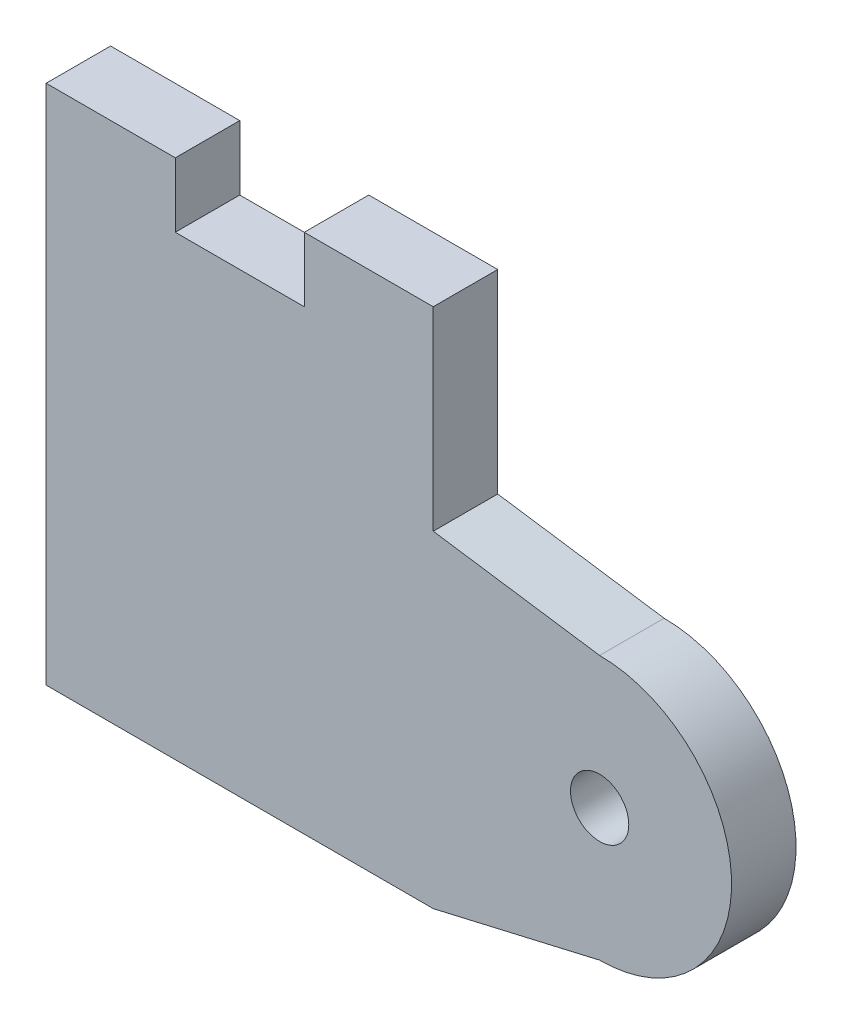
ISO-10303-21;
HEADER;
FILE_DESCRIPTION(('STEP AP214'),'2;1');
FILE_NAME('part.step','',(''),(''),'','','');
FILE_SCHEMA(('AUTOMOTIVE_DESIGN { 1 0 10303 214 1 1 1 1 }'));
ENDSEC;
DATA;
#1=APPLICATION_CONTEXT('core data for automotive mechanical design processes');
#2=APPLICATION_PROTOCOL_DEFINITION('international standard','automotive_design',2000,#1);
#3=PRODUCT_CONTEXT('',#1,'mechanical');
#4=PRODUCT('Part','Part','',(#3));
#5=PRODUCT_RELATED_PRODUCT_CATEGORY('part','',(#4));
#6=PRODUCT_DEFINITION_FORMATION('','',#4);
#7=PRODUCT_DEFINITION_CONTEXT('part definition',#1,'design');
#8=PRODUCT_DEFINITION('design','',#6,#7);
#9=PRODUCT_DEFINITION_SHAPE('','',#8);
#10=(LENGTH_UNIT() NAMED_UNIT(*) SI_UNIT(.MILLI.,.METRE.));
#11=(NAMED_UNIT(*) PLANE_ANGLE_UNIT() SI_UNIT($,.RADIAN.));
#12=(NAMED_UNIT(*) SI_UNIT($,.STERADIAN.) SOLID_ANGLE_UNIT());
#13=UNCERTAINTY_MEASURE_WITH_UNIT(LENGTH_MEASURE(1.E-05),#10,'distance_accuracy_value','');
#14=(GEOMETRIC_REPRESENTATION_CONTEXT(3) GLOBAL_UNCERTAINTY_ASSIGNED_CONTEXT((#13)) GLOBAL_UNIT_ASSIGNED_CONTEXT((#10,
#11,#12)) REPRESENTATION_CONTEXT('',''));
#15=CARTESIAN_POINT('',(0.,0.,0.));
#16=DIRECTION('',(0.,0.,1.));
#17=DIRECTION('',(1.,0.,0.));
#18=AXIS2_PLACEMENT_3D('',#15,#16,#17);
#19=CARTESIAN_POINT('',(0.,0.,6.35));
#20=DIRECTION('',(0.,0.,1.));
#21=DIRECTION('',(1.,0.,0.));
#22=AXIS2_PLACEMENT_3D('',#19,#20,#21);
#23=PLANE('',#22);
#24=DIRECTION('',(0.989427508256329,-0.145028293466039,0.));
#25=VECTOR('',#24,1.);
#26=CARTESIAN_POINT('',(143.03564126646,-21.5470193426889,6.35));
#27=LINE('',#26,#25);
#28=CARTESIAN_POINT('',(126.649884677061,-19.1452281093945,6.35));
#29=VERTEX_POINT('',#28);
#30=CARTESIAN_POINT('',(143.03564126646,-21.5470193426889,6.35));
#31=VERTEX_POINT('',#30);
#32=EDGE_CURVE('E197',#29,#31,#27,.T.);
#33=ORIENTED_EDGE('',*,*,#32,.F.);
#34=DIRECTION('',(0.,1.,0.));
#35=VECTOR('',#34,1.);
#36=CARTESIAN_POINT('',(126.649884677061,0.,6.35));
#37=LINE('',#36,#35);
#38=CARTESIAN_POINT('',(126.649884677061,0.,6.35));
#39=VERTEX_POINT('',#38);
#40=EDGE_CURVE('E156',#29,#39,#37,.T.);
#41=ORIENTED_EDGE('',*,*,#40,.T.);
#42=DIRECTION('',(-1.,0.,0.));
#43=VECTOR('',#42,1.);
#44=CARTESIAN_POINT('',(126.649884677061,0.,6.35));
#45=LINE('',#44,#43);
#46=CARTESIAN_POINT('',(113.949884677061,0.,6.35));
#47=VERTEX_POINT('',#46);
#48=EDGE_CURVE('E94',#39,#47,#45,.T.);
#49=ORIENTED_EDGE('',*,*,#48,.T.);
#50=DIRECTION('',(0.,-1.,0.));
#51=VECTOR('',#50,1.);
#52=CARTESIAN_POINT('',(113.949884677061,0.,6.35));
#53=LINE('',#52,#51);
#54=CARTESIAN_POINT('',(113.949884677061,-6.34999999999999,6.35));
#55=VERTEX_POINT('',#54);
#56=EDGE_CURVE('E170',#47,#55,#53,.T.);
#57=ORIENTED_EDGE('',*,*,#56,.T.);
#58=DIRECTION('',(-1.,0.,0.));
#59=VECTOR('',#58,1.);
#60=CARTESIAN_POINT('',(101.249884677061,-6.34999999999999,6.35));
#61=LINE('',#60,#59);
#62=CARTESIAN_POINT('',(101.249884677061,-6.34999999999999,6.35));
#63=VERTEX_POINT('',#62);
#64=EDGE_CURVE('E116',#55,#63,#61,.T.);
#65=ORIENTED_EDGE('',*,*,#64,.T.);
#66=DIRECTION('',(0.,1.,0.));
#67=VECTOR('',#66,1.);
#68=CARTESIAN_POINT('',(101.249884677061,0.,6.35));
#69=LINE('',#68,#67);
#70=CARTESIAN_POINT('',(101.249884677061,0.,6.35));
#71=VERTEX_POINT('',#70);
#72=EDGE_CURVE('E108',#63,#71,#69,.T.);
#73=ORIENTED_EDGE('',*,*,#72,.T.);
#74=DIRECTION('',(-1.,0.,0.));
#75=VECTOR('',#74,1.);
#76=CARTESIAN_POINT('',(88.5301661419094,0.,6.35));
#77=LINE('',#76,#75);
#78=CARTESIAN_POINT('',(88.5301661419094,0.,6.35));
#79=VERTEX_POINT('',#78);
#80=EDGE_CURVE('E113',#71,#79,#77,.T.);
#81=ORIENTED_EDGE('',*,*,#80,.T.);
#82=DIRECTION('',(0.,-1.,0.));
#83=VECTOR('',#82,1.);
#84=CARTESIAN_POINT('',(88.5301661419094,0.,6.35));
#85=LINE('',#84,#83);
#86=CARTESIAN_POINT('',(88.5301661419094,-51.3291500828519,6.35));
#87=VERTEX_POINT('',#86);
#88=EDGE_CURVE('E50',#79,#87,#85,.T.);
#89=ORIENTED_EDGE('',*,*,#88,.T.);
#90=DIRECTION('',(1.,0.,0.));
#91=VECTOR('',#90,1.);
#92=CARTESIAN_POINT('',(88.5301661419094,-51.3291500828519,6.35));
#93=LINE('',#92,#91);
#94=CARTESIAN_POINT('',(126.649884677061,-51.3291500828519,6.35));
#95=VERTEX_POINT('',#94);
#96=EDGE_CURVE('E134',#87,#95,#93,.T.);
#97=ORIENTED_EDGE('',*,*,#96,.T.);
#98=DIRECTION('',(-0.974189267128087,-0.225732744218559,0.));
#99=VECTOR('',#98,1.);
#100=CARTESIAN_POINT('',(143.03564126646,-47.5323500914842,6.35));
#101=LINE('',#100,#99);
#102=CARTESIAN_POINT('',(143.03564126646,-47.5323500914842,6.35));
#103=VERTEX_POINT('',#102);
#104=EDGE_CURVE('E201',#103,#95,#101,.T.);
#105=ORIENTED_EDGE('',*,*,#104,.F.);
#106=CARTESIAN_POINT('',(143.03564126646,-34.5396847170866,6.35));
#107=DIRECTION('',(0.,0.,-1.));
#108=DIRECTION('',(1.,0.,0.));
#109=AXIS2_PLACEMENT_3D('',#106,#107,#108);
#110=CIRCLE('',#109,12.9926653743977);
#111=EDGE_CURVE('E204',#31,#103,#110,.T.);
#112=ORIENTED_EDGE('',*,*,#111,.F.);
#113=EDGE_LOOP('',(#33,#41,#49,#57,#65,#73,#81,#89,#97,#105,#112));
#114=FACE_BOUND('',#113,.T.);
#115=CARTESIAN_POINT('',(143.03564126646,-34.5396847170866,6.35));
#116=DIRECTION('',(0.,0.,1.));
#117=DIRECTION('',(1.,0.,0.));
#118=AXIS2_PLACEMENT_3D('',#115,#116,#117);
#119=CIRCLE('',#118,2.87020000000002);
#120=CARTESIAN_POINT('',(145.90584126646,-34.5396847170866,6.35));
#121=VERTEX_POINT('',#120);
#122=EDGE_CURVE('E143',#121,#121,#119,.T.);
#123=ORIENTED_EDGE('',*,*,#122,.F.);
#124=EDGE_LOOP('',(#123));
#125=FACE_BOUND('',#124,.T.);
#126=ADVANCED_FACE('F33',(#114,#125),#23,.T.);
#127=CARTESIAN_POINT('',(0.,0.,0.));
#128=DIRECTION('',(0.,0.,1.));
#129=DIRECTION('',(1.,0.,0.));
#130=AXIS2_PLACEMENT_3D('',#127,#128,#129);
#131=PLANE('',#130);
#132=DIRECTION('',(0.,1.,0.));
#133=VECTOR('',#132,1.);
#134=CARTESIAN_POINT('',(126.649884677061,-6.34999999999999,0.));
#135=LINE('',#134,#133);
#136=CARTESIAN_POINT('',(126.649884677061,-19.1452281093945,0.));
#137=VERTEX_POINT('',#136);
#138=CARTESIAN_POINT('',(126.649884677061,0.,0.));
#139=VERTEX_POINT('',#138);
#140=EDGE_CURVE('E154',#137,#139,#135,.T.);
#141=ORIENTED_EDGE('',*,*,#140,.F.);
#142=DIRECTION('',(0.989427508256329,-0.145028293466039,0.));
#143=VECTOR('',#142,1.);
#144=CARTESIAN_POINT('',(143.03564126646,-21.5470193426889,0.));
#145=LINE('',#144,#143);
#146=CARTESIAN_POINT('',(143.03564126646,-21.5470193426889,0.));
#147=VERTEX_POINT('',#146);
#148=EDGE_CURVE('E86',#137,#147,#145,.T.);
#149=ORIENTED_EDGE('',*,*,#148,.T.);
#150=CARTESIAN_POINT('',(143.03564126646,-34.5396847170866,0.));
#151=DIRECTION('',(0.,0.,-1.));
#152=DIRECTION('',(1.,0.,0.));
#153=AXIS2_PLACEMENT_3D('',#150,#151,#152);
#154=CIRCLE('',#153,12.9926653743977);
#155=CARTESIAN_POINT('',(143.03564126646,-47.5323500914842,0.));
#156=VERTEX_POINT('',#155);
#157=EDGE_CURVE('E200',#147,#156,#154,.T.);
#158=ORIENTED_EDGE('',*,*,#157,.T.);
#159=DIRECTION('',(-0.974189267128087,-0.225732744218559,0.));
#160=VECTOR('',#159,1.);
#161=CARTESIAN_POINT('',(143.03564126646,-47.5323500914842,0.));
#162=LINE('',#161,#160);
#163=CARTESIAN_POINT('',(126.649884677061,-51.3291500828519,0.));
#164=VERTEX_POINT('',#163);
#165=EDGE_CURVE('E208',#156,#164,#162,.T.);
#166=ORIENTED_EDGE('',*,*,#165,.T.);
#167=DIRECTION('',(1.,0.,0.));
#168=VECTOR('',#167,1.);
#169=CARTESIAN_POINT('',(88.5301661419094,-51.3291500828519,0.));
#170=LINE('',#169,#168);
#171=CARTESIAN_POINT('',(88.5301661419094,-51.3291500828519,0.));
#172=VERTEX_POINT('',#171);
#173=EDGE_CURVE('E151',#172,#164,#170,.T.);
#174=ORIENTED_EDGE('',*,*,#173,.F.);
#175=DIRECTION('',(0.,-1.,0.));
#176=VECTOR('',#175,1.);
#177=CARTESIAN_POINT('',(88.5301661419094,-19.1452281093945,0.));
#178=LINE('',#177,#176);
#179=CARTESIAN_POINT('',(88.5301661419094,0.,0.));
#180=VERTEX_POINT('',#179);
#181=EDGE_CURVE('E78',#180,#172,#178,.T.);
#182=ORIENTED_EDGE('',*,*,#181,.F.);
#183=DIRECTION('',(-1.,0.,0.));
#184=VECTOR('',#183,1.);
#185=CARTESIAN_POINT('',(88.5301661419094,0.,0.));
#186=LINE('',#185,#184);
#187=CARTESIAN_POINT('',(101.249884677061,0.,0.));
#188=VERTEX_POINT('',#187);
#189=EDGE_CURVE('E148',#188,#180,#186,.T.);
#190=ORIENTED_EDGE('',*,*,#189,.F.);
#191=DIRECTION('',(0.,1.,0.));
#192=VECTOR('',#191,1.);
#193=CARTESIAN_POINT('',(101.249884677061,0.,0.));
#194=LINE('',#193,#192);
#195=CARTESIAN_POINT('',(101.249884677061,-6.34999999999999,0.));
#196=VERTEX_POINT('',#195);
#197=EDGE_CURVE('E125',#196,#188,#194,.T.);
#198=ORIENTED_EDGE('',*,*,#197,.F.);
#199=DIRECTION('',(-1.,0.,0.));
#200=VECTOR('',#199,1.);
#201=CARTESIAN_POINT('',(101.249884677061,-6.34999999999999,0.));
#202=LINE('',#201,#200);
#203=CARTESIAN_POINT('',(113.949884677061,-6.34999999999999,0.));
#204=VERTEX_POINT('',#203);
#205=EDGE_CURVE('E145',#204,#196,#202,.T.);
#206=ORIENTED_EDGE('',*,*,#205,.F.);
#207=DIRECTION('',(0.,-1.,0.));
#208=VECTOR('',#207,1.);
#209=CARTESIAN_POINT('',(113.949884677061,0.,0.));
#210=LINE('',#209,#208);
#211=CARTESIAN_POINT('',(113.949884677061,0.,0.));
#212=VERTEX_POINT('',#211);
#213=EDGE_CURVE('E142',#212,#204,#210,.T.);
#214=ORIENTED_EDGE('',*,*,#213,.F.);
#215=DIRECTION('',(-1.,0.,0.));
#216=VECTOR('',#215,1.);
#217=CARTESIAN_POINT('',(126.649884677061,0.,0.));
#218=LINE('',#217,#216);
#219=EDGE_CURVE('E140',#139,#212,#218,.T.);
#220=ORIENTED_EDGE('',*,*,#219,.F.);
#221=EDGE_LOOP('',(#141,#149,#158,#166,#174,#182,#190,#198,#206,#214,#220));
#222=FACE_BOUND('',#221,.T.);
#223=CARTESIAN_POINT('',(143.03564126646,-34.5396847170866,0.));
#224=DIRECTION('',(0.,0.,1.));
#225=DIRECTION('',(1.,0.,0.));
#226=AXIS2_PLACEMENT_3D('',#223,#224,#225);
#227=CIRCLE('',#226,2.87020000000002);
#228=CARTESIAN_POINT('',(145.90584126646,-34.5396847170866,0.));
#229=VERTEX_POINT('',#228);
#230=EDGE_CURVE('E183',#229,#229,#227,.T.);
#231=ORIENTED_EDGE('',*,*,#230,.T.);
#232=EDGE_LOOP('',(#231));
#233=FACE_BOUND('',#232,.T.);
#234=ADVANCED_FACE('F175',(#222,#233),#131,.F.);
#235=CARTESIAN_POINT('',(126.649884677061,0.,6.35));
#236=DIRECTION('',(0.,-1.,0.));
#237=DIRECTION('',(1.,0.,0.));
#238=AXIS2_PLACEMENT_3D('',#235,#236,#237);
#239=PLANE('',#238);
#240=ORIENTED_EDGE('',*,*,#219,.T.);
#241=DIRECTION('',(0.,0.,-1.));
#242=VECTOR('',#241,1.);
#243=CARTESIAN_POINT('',(113.949884677061,0.,6.35));
#244=LINE('',#243,#242);
#245=EDGE_CURVE('E42',#47,#212,#244,.T.);
#246=ORIENTED_EDGE('',*,*,#245,.F.);
#247=ORIENTED_EDGE('',*,*,#48,.F.);
#248=DIRECTION('',(0.,0.,-1.));
#249=VECTOR('',#248,1.);
#250=CARTESIAN_POINT('',(126.649884677061,0.,6.35));
#251=LINE('',#250,#249);
#252=EDGE_CURVE('E11',#39,#139,#251,.T.);
#253=ORIENTED_EDGE('',*,*,#252,.T.);
#254=EDGE_LOOP('',(#240,#246,#247,#253));
#255=FACE_BOUND('',#254,.T.);
#256=ADVANCED_FACE('F35',(#255),#239,.F.);
#257=CARTESIAN_POINT('',(113.949884677061,0.,6.35));
#258=DIRECTION('',(1.,0.,0.));
#259=DIRECTION('',(0.,0.,-1.));
#260=AXIS2_PLACEMENT_3D('',#257,#258,#259);
#261=PLANE('',#260);
#262=ORIENTED_EDGE('',*,*,#213,.T.);
#263=DIRECTION('',(0.,0.,-1.));
#264=VECTOR('',#263,1.);
#265=CARTESIAN_POINT('',(113.949884677061,-6.34999999999999,6.35));
#266=LINE('',#265,#264);
#267=EDGE_CURVE('E162',#55,#204,#266,.T.);
#268=ORIENTED_EDGE('',*,*,#267,.F.);
#269=ORIENTED_EDGE('',*,*,#56,.F.);
#270=ORIENTED_EDGE('',*,*,#245,.T.);
#271=EDGE_LOOP('',(#262,#268,#269,#270));
#272=FACE_BOUND('',#271,.T.);
#273=ADVANCED_FACE('F168',(#272),#261,.F.);
#274=CARTESIAN_POINT('',(101.249884677061,-6.34999999999999,6.35));
#275=DIRECTION('',(0.,-1.,0.));
#276=DIRECTION('',(1.,0.,0.));
#277=AXIS2_PLACEMENT_3D('',#274,#275,#276);
#278=PLANE('',#277);
#279=ORIENTED_EDGE('',*,*,#205,.T.);
#280=DIRECTION('',(0.,0.,-1.));
#281=VECTOR('',#280,1.);
#282=CARTESIAN_POINT('',(101.249884677061,-6.34999999999999,6.35));
#283=LINE('',#282,#281);
#284=EDGE_CURVE('E129',#63,#196,#283,.T.);
#285=ORIENTED_EDGE('',*,*,#284,.F.);
#286=ORIENTED_EDGE('',*,*,#64,.F.);
#287=ORIENTED_EDGE('',*,*,#267,.T.);
#288=EDGE_LOOP('',(#279,#285,#286,#287));
#289=FACE_BOUND('',#288,.T.);
#290=ADVANCED_FACE('F178',(#289),#278,.F.);
#291=CARTESIAN_POINT('',(101.249884677061,0.,6.35));
#292=DIRECTION('',(-1.,0.,0.));
#293=DIRECTION('',(0.,0.,1.));
#294=AXIS2_PLACEMENT_3D('',#291,#292,#293);
#295=PLANE('',#294);
#296=ORIENTED_EDGE('',*,*,#197,.T.);
#297=DIRECTION('',(0.,0.,-1.));
#298=VECTOR('',#297,1.);
#299=CARTESIAN_POINT('',(101.249884677061,0.,6.35));
#300=LINE('',#299,#298);
#301=EDGE_CURVE('E122',#71,#188,#300,.T.);
#302=ORIENTED_EDGE('',*,*,#301,.F.);
#303=ORIENTED_EDGE('',*,*,#72,.F.);
#304=ORIENTED_EDGE('',*,*,#284,.T.);
#305=EDGE_LOOP('',(#296,#302,#303,#304));
#306=FACE_BOUND('',#305,.T.);
#307=ADVANCED_FACE('F123',(#306),#295,.F.);
#308=CARTESIAN_POINT('',(88.5301661419094,0.,6.35));
#309=DIRECTION('',(0.,-1.,0.));
#310=DIRECTION('',(1.,0.,0.));
#311=AXIS2_PLACEMENT_3D('',#308,#309,#310);
#312=PLANE('',#311);
#313=ORIENTED_EDGE('',*,*,#189,.T.);
#314=DIRECTION('',(0.,0.,-1.));
#315=VECTOR('',#314,1.);
#316=CARTESIAN_POINT('',(88.5301661419094,0.,6.35));
#317=LINE('',#316,#315);
#318=EDGE_CURVE('E130',#79,#180,#317,.T.);
#319=ORIENTED_EDGE('',*,*,#318,.F.);
#320=ORIENTED_EDGE('',*,*,#80,.F.);
#321=ORIENTED_EDGE('',*,*,#301,.T.);
#322=EDGE_LOOP('',(#313,#319,#320,#321));
#323=FACE_BOUND('',#322,.T.);
#324=ADVANCED_FACE('F132',(#323),#312,.F.);
#325=CARTESIAN_POINT('',(88.5301661419094,-19.1452281093945,6.35));
#326=DIRECTION('',(1.,0.,0.));
#327=DIRECTION('',(0.,0.,-1.));
#328=AXIS2_PLACEMENT_3D('',#325,#326,#327);
#329=PLANE('',#328);
#330=ORIENTED_EDGE('',*,*,#181,.T.);
#331=DIRECTION('',(0.,0.,-1.));
#332=VECTOR('',#331,1.);
#333=CARTESIAN_POINT('',(88.5301661419094,-51.3291500828519,6.35));
#334=LINE('',#333,#332);
#335=EDGE_CURVE('E158',#87,#172,#334,.T.);
#336=ORIENTED_EDGE('',*,*,#335,.F.);
#337=ORIENTED_EDGE('',*,*,#88,.F.);
#338=ORIENTED_EDGE('',*,*,#318,.T.);
#339=EDGE_LOOP('',(#330,#336,#337,#338));
#340=FACE_BOUND('',#339,.T.);
#341=ADVANCED_FACE('F255',(#340),#329,.F.);
#342=CARTESIAN_POINT('',(88.5301661419094,-51.3291500828519,6.35));
#343=DIRECTION('',(0.,1.,0.));
#344=DIRECTION('',(0.,0.,1.));
#345=AXIS2_PLACEMENT_3D('',#342,#343,#344);
#346=PLANE('',#345);
#347=ORIENTED_EDGE('',*,*,#173,.T.);
#348=DIRECTION('',(0.,0.,1.));
#349=VECTOR('',#348,1.);
#350=CARTESIAN_POINT('',(126.649884677061,-51.3291500828519,0.));
#351=LINE('',#350,#349);
#352=EDGE_CURVE('E192',#164,#95,#351,.T.);
#353=ORIENTED_EDGE('',*,*,#352,.T.);
#354=ORIENTED_EDGE('',*,*,#96,.F.);
#355=ORIENTED_EDGE('',*,*,#335,.T.);
#356=EDGE_LOOP('',(#347,#353,#354,#355));
#357=FACE_BOUND('',#356,.T.);
#358=ADVANCED_FACE('F252',(#357),#346,.F.);
#359=CARTESIAN_POINT('',(126.649884677061,-6.34999999999999,6.35));
#360=DIRECTION('',(-1.,0.,0.));
#361=DIRECTION('',(0.,0.,1.));
#362=AXIS2_PLACEMENT_3D('',#359,#360,#361);
#363=PLANE('',#362);
#364=ORIENTED_EDGE('',*,*,#140,.T.);
#365=ORIENTED_EDGE('',*,*,#252,.F.);
#366=ORIENTED_EDGE('',*,*,#40,.F.);
#367=DIRECTION('',(0.,0.,-1.));
#368=VECTOR('',#367,1.);
#369=CARTESIAN_POINT('',(126.649884677061,-19.1452281093945,6.35));
#370=LINE('',#369,#368);
#371=EDGE_CURVE('E139',#29,#137,#370,.T.);
#372=ORIENTED_EDGE('',*,*,#371,.T.);
#373=EDGE_LOOP('',(#364,#365,#366,#372));
#374=FACE_BOUND('',#373,.T.);
#375=ADVANCED_FACE('F235',(#374),#363,.F.);
#376=CARTESIAN_POINT('',(143.03564126646,-34.5396847170866,6.35));
#377=DIRECTION('',(0.,0.,-1.));
#378=DIRECTION('',(-1.,0.,0.));
#379=AXIS2_PLACEMENT_3D('',#376,#377,#378);
#380=CYLINDRICAL_SURFACE('',#379,2.87020000000002);
#381=ORIENTED_EDGE('',*,*,#122,.T.);
#382=EDGE_LOOP('',(#381));
#383=FACE_BOUND('',#382,.T.);
#384=ORIENTED_EDGE('',*,*,#230,.F.);
#385=EDGE_LOOP('',(#384));
#386=FACE_BOUND('',#385,.T.);
#387=ADVANCED_FACE('F247',(#383,#386),#380,.F.);
#388=CARTESIAN_POINT('',(143.03564126646,-34.5396847170866,0.));
#389=DIRECTION('',(0.,0.,1.));
#390=DIRECTION('',(1.,0.,0.));
#391=AXIS2_PLACEMENT_3D('',#388,#389,#390);
#392=CYLINDRICAL_SURFACE('',#391,12.9926653743977);
#393=ORIENTED_EDGE('',*,*,#111,.T.);
#394=DIRECTION('',(0.,0.,1.));
#395=VECTOR('',#394,1.);
#396=CARTESIAN_POINT('',(143.03564126646,-47.5323500914842,0.));
#397=LINE('',#396,#395);
#398=EDGE_CURVE('E189',#156,#103,#397,.T.);
#399=ORIENTED_EDGE('',*,*,#398,.F.);
#400=ORIENTED_EDGE('',*,*,#157,.F.);
#401=DIRECTION('',(0.,0.,1.));
#402=VECTOR('',#401,1.);
#403=CARTESIAN_POINT('',(143.03564126646,-21.5470193426889,0.));
#404=LINE('',#403,#402);
#405=EDGE_CURVE('E186',#147,#31,#404,.T.);
#406=ORIENTED_EDGE('',*,*,#405,.T.);
#407=EDGE_LOOP('',(#393,#399,#400,#406));
#408=FACE_BOUND('',#407,.T.);
#409=ADVANCED_FACE('F220',(#408),#392,.T.);
#410=CARTESIAN_POINT('',(143.03564126646,-21.5470193426889,0.));
#411=DIRECTION('',(-0.145028293466039,-0.989427508256329,0.));
#412=DIRECTION('',(0.989427508256329,-0.145028293466039,0.));
#413=AXIS2_PLACEMENT_3D('',#410,#411,#412);
#414=PLANE('',#413);
#415=ORIENTED_EDGE('',*,*,#32,.T.);
#416=ORIENTED_EDGE('',*,*,#405,.F.);
#417=ORIENTED_EDGE('',*,*,#148,.F.);
#418=ORIENTED_EDGE('',*,*,#371,.F.);
#419=EDGE_LOOP('',(#415,#416,#417,#418));
#420=FACE_BOUND('',#419,.T.);
#421=ADVANCED_FACE('F229',(#420),#414,.F.);
#422=CARTESIAN_POINT('',(143.03564126646,-47.5323500914842,0.));
#423=DIRECTION('',(-0.225732744218559,0.974189267128087,0.));
#424=DIRECTION('',(-0.974189267128087,-0.225732744218559,0.));
#425=AXIS2_PLACEMENT_3D('',#422,#423,#424);
#426=PLANE('',#425);
#427=ORIENTED_EDGE('',*,*,#104,.T.);
#428=ORIENTED_EDGE('',*,*,#352,.F.);
#429=ORIENTED_EDGE('',*,*,#165,.F.);
#430=ORIENTED_EDGE('',*,*,#398,.T.);
#431=EDGE_LOOP('',(#427,#428,#429,#430));
#432=FACE_BOUND('',#431,.T.);
#433=ADVANCED_FACE('F306',(#432),#426,.F.);
#434=CLOSED_SHELL('',(#126,#234,#256,#273,#290,#307,#324,#341,#358,#375,#387,#409,#421,#433));
#435=MANIFOLD_SOLID_BREP('B2',#434);
#436=ADVANCED_BREP_SHAPE_REPRESENTATION('',(#18,#435),#14);
#437=SHAPE_DEFINITION_REPRESENTATION(#9,#436);
ENDSEC;
END-ISO-10303-21;
